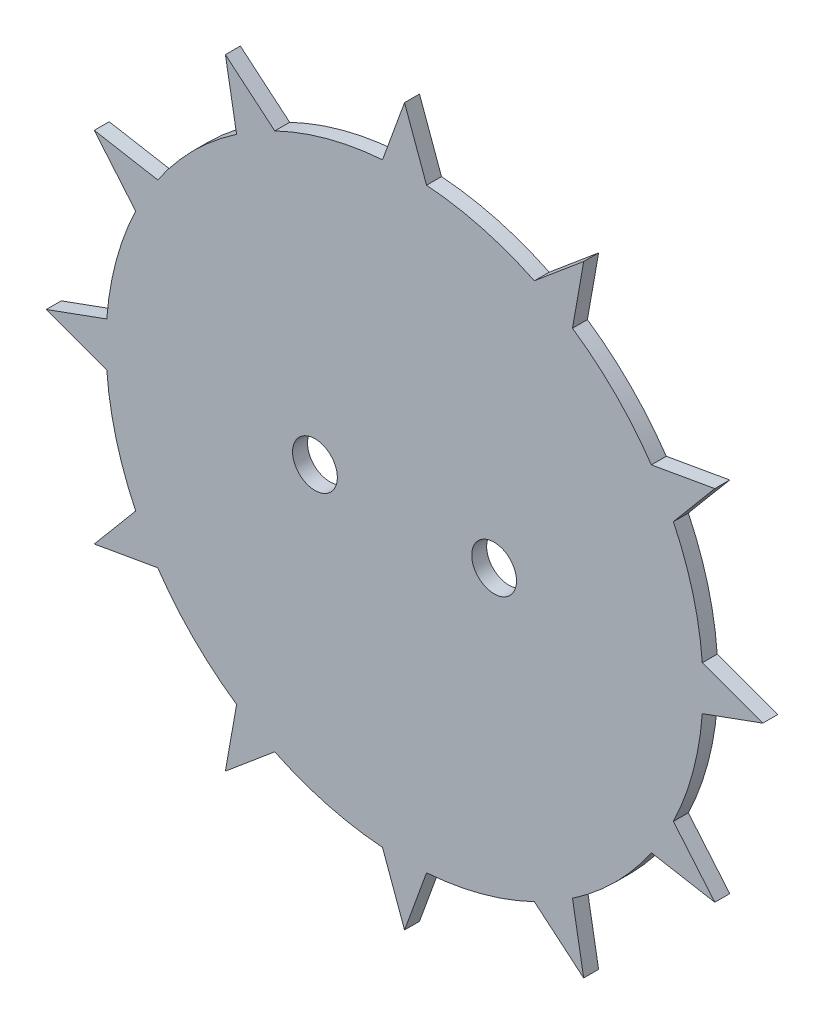
ISO-10303-21;
HEADER;
FILE_DESCRIPTION(('STEP AP214'),'2;1');
FILE_NAME('part.step','',(''),(''),'','','');
FILE_SCHEMA(('AUTOMOTIVE_DESIGN { 1 0 10303 214 1 1 1 1 }'));
ENDSEC;
DATA;
#1=APPLICATION_CONTEXT('core data for automotive mechanical design processes');
#2=APPLICATION_PROTOCOL_DEFINITION('international standard','automotive_design',2000,#1);
#3=PRODUCT_CONTEXT('',#1,'mechanical');
#4=PRODUCT('Part','Part','',(#3));
#5=PRODUCT_RELATED_PRODUCT_CATEGORY('part','',(#4));
#6=PRODUCT_DEFINITION_FORMATION('','',#4);
#7=PRODUCT_DEFINITION_CONTEXT('part definition',#1,'design');
#8=PRODUCT_DEFINITION('design','',#6,#7);
#9=PRODUCT_DEFINITION_SHAPE('','',#8);
#10=(LENGTH_UNIT() NAMED_UNIT(*) SI_UNIT(.MILLI.,.METRE.));
#11=(NAMED_UNIT(*) PLANE_ANGLE_UNIT() SI_UNIT($,.RADIAN.));
#12=(NAMED_UNIT(*) SI_UNIT($,.STERADIAN.) SOLID_ANGLE_UNIT());
#13=UNCERTAINTY_MEASURE_WITH_UNIT(LENGTH_MEASURE(1.E-05),#10,'distance_accuracy_value','');
#14=(GEOMETRIC_REPRESENTATION_CONTEXT(3) GLOBAL_UNCERTAINTY_ASSIGNED_CONTEXT((#13)) GLOBAL_UNIT_ASSIGNED_CONTEXT((#10,
#11,#12)) REPRESENTATION_CONTEXT('',''));
#15=CARTESIAN_POINT('',(0.,0.,0.));
#16=DIRECTION('',(0.,0.,1.));
#17=DIRECTION('',(1.,0.,0.));
#18=AXIS2_PLACEMENT_3D('',#15,#16,#17);
#19=CARTESIAN_POINT('',(0.,0.,1.));
#20=DIRECTION('',(0.,0.,-1.));
#21=DIRECTION('',(-1.,0.,0.));
#22=AXIS2_PLACEMENT_3D('',#19,#20,#21);
#23=CYLINDRICAL_SURFACE('',#22,20.);
#24=DIRECTION('',(0.,0.,-1.));
#25=VECTOR('',#24,1.);
#26=CARTESIAN_POINT('',(-8.6947263668177,18.0111558042832,1.));
#27=LINE('',#26,#25);
#28=CARTESIAN_POINT('',(-8.6947263668177,18.0111558042832,1.));
#29=VERTEX_POINT('',#28);
#30=CARTESIAN_POINT('',(-8.6947263668177,18.0111558042832,0.));
#31=VERTEX_POINT('',#30);
#32=EDGE_CURVE('E455',#29,#31,#27,.T.);
#33=ORIENTED_EDGE('',*,*,#32,.F.);
#34=CARTESIAN_POINT('',(0.,0.,1.));
#35=DIRECTION('',(0.,0.,1.));
#36=DIRECTION('',(1.,0.,0.));
#37=AXIS2_PLACEMENT_3D('',#34,#35,#36);
#38=CIRCLE('',#37,20.);
#39=CARTESIAN_POINT('',(-1.47572398952312,19.9454816614377,1.));
#40=VERTEX_POINT('',#39);
#41=EDGE_CURVE('E592',#40,#29,#38,.T.);
#42=ORIENTED_EDGE('',*,*,#41,.F.);
#43=DIRECTION('',(0.,0.,-1.));
#44=VECTOR('',#43,1.);
#45=CARTESIAN_POINT('',(-1.47572398952312,19.9454816614377,1.));
#46=LINE('',#45,#44);
#47=CARTESIAN_POINT('',(-1.47572398952312,19.9454816614377,0.));
#48=VERTEX_POINT('',#47);
#49=EDGE_CURVE('E288',#40,#48,#46,.T.);
#50=ORIENTED_EDGE('',*,*,#49,.T.);
#51=CARTESIAN_POINT('',(0.,0.,0.));
#52=DIRECTION('',(0.,0.,1.));
#53=DIRECTION('',(1.,0.,0.));
#54=AXIS2_PLACEMENT_3D('',#51,#52,#53);
#55=CIRCLE('',#54,20.);
#56=EDGE_CURVE('E302',#48,#31,#55,.T.);
#57=ORIENTED_EDGE('',*,*,#56,.T.);
#58=EDGE_LOOP('',(#33,#42,#50,#57));
#59=FACE_BOUND('',#58,.T.);
#60=ADVANCED_FACE('F36',(#59),#23,.T.);
#61=CARTESIAN_POINT('',(-11.25075529462,16.5354318147601,1.));
#62=VERTEX_POINT('',#61);
#63=CARTESIAN_POINT('',(-16.5354318147601,11.25075529462,1.));
#64=VERTEX_POINT('',#63);
#65=EDGE_CURVE('E596',#62,#64,#38,.T.);
#66=ORIENTED_EDGE('',*,*,#65,.F.);
#67=DIRECTION('',(0.,0.,-1.));
#68=VECTOR('',#67,1.);
#69=CARTESIAN_POINT('',(-11.25075529462,16.5354318147601,1.));
#70=LINE('',#69,#68);
#71=CARTESIAN_POINT('',(-11.25075529462,16.5354318147601,0.));
#72=VERTEX_POINT('',#71);
#73=EDGE_CURVE('E464',#62,#72,#70,.T.);
#74=ORIENTED_EDGE('',*,*,#73,.T.);
#75=CARTESIAN_POINT('',(-16.5354318147601,11.25075529462,0.));
#76=VERTEX_POINT('',#75);
#77=EDGE_CURVE('E308',#72,#76,#55,.T.);
#78=ORIENTED_EDGE('',*,*,#77,.T.);
#79=DIRECTION('',(0.,0.,-1.));
#80=VECTOR('',#79,1.);
#81=CARTESIAN_POINT('',(-16.5354318147601,11.25075529462,1.));
#82=LINE('',#81,#80);
#83=EDGE_CURVE('E473',#64,#76,#82,.T.);
#84=ORIENTED_EDGE('',*,*,#83,.F.);
#85=EDGE_LOOP('',(#66,#74,#78,#84));
#86=FACE_BOUND('',#85,.T.);
#87=ADVANCED_FACE('F644',(#86),#23,.T.);
#88=CARTESIAN_POINT('',(-18.0111558042832,8.69472636681768,1.));
#89=VERTEX_POINT('',#88);
#90=CARTESIAN_POINT('',(-19.9454816614377,1.47572398952311,1.));
#91=VERTEX_POINT('',#90);
#92=EDGE_CURVE('E597',#89,#91,#38,.T.);
#93=ORIENTED_EDGE('',*,*,#92,.F.);
#94=DIRECTION('',(0.,0.,-1.));
#95=VECTOR('',#94,1.);
#96=CARTESIAN_POINT('',(-18.0111558042832,8.69472636681768,1.));
#97=LINE('',#96,#95);
#98=CARTESIAN_POINT('',(-18.0111558042832,8.69472636681768,0.));
#99=VERTEX_POINT('',#98);
#100=EDGE_CURVE('E476',#89,#99,#97,.T.);
#101=ORIENTED_EDGE('',*,*,#100,.T.);
#102=CARTESIAN_POINT('',(-19.9454816614377,1.47572398952311,0.));
#103=VERTEX_POINT('',#102);
#104=EDGE_CURVE('E313',#99,#103,#55,.T.);
#105=ORIENTED_EDGE('',*,*,#104,.T.);
#106=DIRECTION('',(0.,0.,-1.));
#107=VECTOR('',#106,1.);
#108=CARTESIAN_POINT('',(-19.9454816614377,1.47572398952311,1.));
#109=LINE('',#108,#107);
#110=EDGE_CURVE('E488',#91,#103,#109,.T.);
#111=ORIENTED_EDGE('',*,*,#110,.F.);
#112=EDGE_LOOP('',(#93,#101,#105,#111));
#113=FACE_BOUND('',#112,.T.);
#114=ADVANCED_FACE('F648',(#113),#23,.T.);
#115=CARTESIAN_POINT('',(-19.9454816614377,-1.47572398952312,1.));
#116=VERTEX_POINT('',#115);
#117=CARTESIAN_POINT('',(-18.0111558042832,-8.69472636681769,1.));
#118=VERTEX_POINT('',#117);
#119=EDGE_CURVE('E605',#116,#118,#38,.T.);
#120=ORIENTED_EDGE('',*,*,#119,.F.);
#121=DIRECTION('',(0.,0.,-1.));
#122=VECTOR('',#121,1.);
#123=CARTESIAN_POINT('',(-19.9454816614377,-1.47572398952312,1.));
#124=LINE('',#123,#122);
#125=CARTESIAN_POINT('',(-19.9454816614377,-1.47572398952312,0.));
#126=VERTEX_POINT('',#125);
#127=EDGE_CURVE('E494',#116,#126,#124,.T.);
#128=ORIENTED_EDGE('',*,*,#127,.T.);
#129=CARTESIAN_POINT('',(-18.0111558042832,-8.69472636681769,0.));
#130=VERTEX_POINT('',#129);
#131=EDGE_CURVE('E320',#126,#130,#55,.T.);
#132=ORIENTED_EDGE('',*,*,#131,.T.);
#133=DIRECTION('',(0.,0.,-1.));
#134=VECTOR('',#133,1.);
#135=CARTESIAN_POINT('',(-18.0111558042832,-8.69472636681769,1.));
#136=LINE('',#135,#134);
#137=EDGE_CURVE('E502',#118,#130,#136,.T.);
#138=ORIENTED_EDGE('',*,*,#137,.F.);
#139=EDGE_LOOP('',(#120,#128,#132,#138));
#140=FACE_BOUND('',#139,.T.);
#141=ADVANCED_FACE('F748',(#140),#23,.T.);
#142=CARTESIAN_POINT('',(-16.5354318147601,-11.25075529462,1.));
#143=VERTEX_POINT('',#142);
#144=CARTESIAN_POINT('',(-11.25075529462,-16.5354318147601,1.));
#145=VERTEX_POINT('',#144);
#146=EDGE_CURVE('E604',#143,#145,#38,.T.);
#147=ORIENTED_EDGE('',*,*,#146,.F.);
#148=DIRECTION('',(0.,0.,-1.));
#149=VECTOR('',#148,1.);
#150=CARTESIAN_POINT('',(-16.5354318147601,-11.25075529462,1.));
#151=LINE('',#150,#149);
#152=CARTESIAN_POINT('',(-16.5354318147601,-11.25075529462,0.));
#153=VERTEX_POINT('',#152);
#154=EDGE_CURVE('E506',#143,#153,#151,.T.);
#155=ORIENTED_EDGE('',*,*,#154,.T.);
#156=CARTESIAN_POINT('',(-11.25075529462,-16.5354318147601,0.));
#157=VERTEX_POINT('',#156);
#158=EDGE_CURVE('E323',#153,#157,#55,.T.);
#159=ORIENTED_EDGE('',*,*,#158,.T.);
#160=DIRECTION('',(0.,0.,-1.));
#161=VECTOR('',#160,1.);
#162=CARTESIAN_POINT('',(-11.25075529462,-16.5354318147601,1.));
#163=LINE('',#162,#161);
#164=EDGE_CURVE('E388',#145,#157,#163,.T.);
#165=ORIENTED_EDGE('',*,*,#164,.F.);
#166=EDGE_LOOP('',(#147,#155,#159,#165));
#167=FACE_BOUND('',#166,.T.);
#168=ADVANCED_FACE('F743',(#167),#23,.T.);
#169=CARTESIAN_POINT('',(-8.69472636681769,-18.0111558042832,1.));
#170=VERTEX_POINT('',#169);
#171=CARTESIAN_POINT('',(-1.47572398952312,-19.9454816614377,1.));
#172=VERTEX_POINT('',#171);
#173=EDGE_CURVE('E609',#170,#172,#38,.T.);
#174=ORIENTED_EDGE('',*,*,#173,.F.);
#175=DIRECTION('',(0.,0.,-1.));
#176=VECTOR('',#175,1.);
#177=CARTESIAN_POINT('',(-8.69472636681769,-18.0111558042832,1.));
#178=LINE('',#177,#176);
#179=CARTESIAN_POINT('',(-8.69472636681768,-18.0111558042832,0.));
#180=VERTEX_POINT('',#179);
#181=EDGE_CURVE('E399',#170,#180,#178,.T.);
#182=ORIENTED_EDGE('',*,*,#181,.T.);
#183=CARTESIAN_POINT('',(-1.47572398952312,-19.9454816614377,0.));
#184=VERTEX_POINT('',#183);
#185=EDGE_CURVE('E328',#180,#184,#55,.T.);
#186=ORIENTED_EDGE('',*,*,#185,.T.);
#187=DIRECTION('',(0.,0.,-1.));
#188=VECTOR('',#187,1.);
#189=CARTESIAN_POINT('',(-1.47572398952312,-19.9454816614377,1.));
#190=LINE('',#189,#188);
#191=EDGE_CURVE('E408',#172,#184,#190,.T.);
#192=ORIENTED_EDGE('',*,*,#191,.F.);
#193=EDGE_LOOP('',(#174,#182,#186,#192));
#194=FACE_BOUND('',#193,.T.);
#195=ADVANCED_FACE('F736',(#194),#23,.T.);
#196=CARTESIAN_POINT('',(1.47572398952312,-19.9454816614377,1.));
#197=VERTEX_POINT('',#196);
#198=CARTESIAN_POINT('',(8.69472636681769,-18.0111558042832,1.));
#199=VERTEX_POINT('',#198);
#200=EDGE_CURVE('E369',#197,#199,#38,.T.);
#201=ORIENTED_EDGE('',*,*,#200,.F.);
#202=DIRECTION('',(0.,0.,-1.));
#203=VECTOR('',#202,1.);
#204=CARTESIAN_POINT('',(1.47572398952312,-19.9454816614377,1.));
#205=LINE('',#204,#203);
#206=CARTESIAN_POINT('',(1.47572398952312,-19.9454816614377,0.));
#207=VERTEX_POINT('',#206);
#208=EDGE_CURVE('E418',#197,#207,#205,.T.);
#209=ORIENTED_EDGE('',*,*,#208,.T.);
#210=CARTESIAN_POINT('',(8.69472636681769,-18.0111558042832,0.));
#211=VERTEX_POINT('',#210);
#212=EDGE_CURVE('E333',#207,#211,#55,.T.);
#213=ORIENTED_EDGE('',*,*,#212,.T.);
#214=DIRECTION('',(0.,0.,-1.));
#215=VECTOR('',#214,1.);
#216=CARTESIAN_POINT('',(8.69472636681769,-18.0111558042832,1.));
#217=LINE('',#216,#215);
#218=EDGE_CURVE('E422',#199,#211,#217,.T.);
#219=ORIENTED_EDGE('',*,*,#218,.F.);
#220=EDGE_LOOP('',(#201,#209,#213,#219));
#221=FACE_BOUND('',#220,.T.);
#222=ADVANCED_FACE('F618',(#221),#23,.T.);
#223=CARTESIAN_POINT('',(11.25075529462,-16.5354318147601,1.));
#224=VERTEX_POINT('',#223);
#225=CARTESIAN_POINT('',(16.5354318147601,-11.25075529462,1.));
#226=VERTEX_POINT('',#225);
#227=EDGE_CURVE('E365',#224,#226,#38,.T.);
#228=ORIENTED_EDGE('',*,*,#227,.F.);
#229=DIRECTION('',(0.,0.,-1.));
#230=VECTOR('',#229,1.);
#231=CARTESIAN_POINT('',(11.25075529462,-16.5354318147601,1.));
#232=LINE('',#231,#230);
#233=CARTESIAN_POINT('',(11.25075529462,-16.5354318147601,0.));
#234=VERTEX_POINT('',#233);
#235=EDGE_CURVE('E435',#224,#234,#232,.T.);
#236=ORIENTED_EDGE('',*,*,#235,.T.);
#237=CARTESIAN_POINT('',(16.5354318147601,-11.25075529462,0.));
#238=VERTEX_POINT('',#237);
#239=EDGE_CURVE('E343',#234,#238,#55,.T.);
#240=ORIENTED_EDGE('',*,*,#239,.T.);
#241=DIRECTION('',(0.,0.,-1.));
#242=VECTOR('',#241,1.);
#243=CARTESIAN_POINT('',(16.5354318147601,-11.25075529462,1.));
#244=LINE('',#243,#242);
#245=EDGE_CURVE('E439',#226,#238,#244,.T.);
#246=ORIENTED_EDGE('',*,*,#245,.F.);
#247=EDGE_LOOP('',(#228,#236,#240,#246));
#248=FACE_BOUND('',#247,.T.);
#249=ADVANCED_FACE('F624',(#248),#23,.T.);
#250=DIRECTION('',(0.,0.,-1.));
#251=VECTOR('',#250,1.);
#252=CARTESIAN_POINT('',(1.47572398952311,19.9454816614377,1.));
#253=LINE('',#252,#251);
#254=CARTESIAN_POINT('',(1.47572398952311,19.9454816614377,1.));
#255=VERTEX_POINT('',#254);
#256=CARTESIAN_POINT('',(1.47572398952311,19.9454816614377,0.));
#257=VERTEX_POINT('',#256);
#258=EDGE_CURVE('E273',#255,#257,#253,.T.);
#259=ORIENTED_EDGE('',*,*,#258,.F.);
#260=CARTESIAN_POINT('',(8.69472636681767,18.0111558042832,1.));
#261=VERTEX_POINT('',#260);
#262=EDGE_CURVE('E593',#261,#255,#38,.T.);
#263=ORIENTED_EDGE('',*,*,#262,.F.);
#264=DIRECTION('',(0.,0.,-1.));
#265=VECTOR('',#264,1.);
#266=CARTESIAN_POINT('',(8.69472636681767,18.0111558042832,1.));
#267=LINE('',#266,#265);
#268=CARTESIAN_POINT('',(8.69472636681767,18.0111558042832,0.));
#269=VERTEX_POINT('',#268);
#270=EDGE_CURVE('E303',#261,#269,#267,.T.);
#271=ORIENTED_EDGE('',*,*,#270,.T.);
#272=EDGE_CURVE('E295',#269,#257,#55,.T.);
#273=ORIENTED_EDGE('',*,*,#272,.T.);
#274=EDGE_LOOP('',(#259,#263,#271,#273));
#275=FACE_BOUND('',#274,.T.);
#276=ADVANCED_FACE('F298',(#275),#23,.T.);
#277=DIRECTION('',(0.,0.,-1.));
#278=VECTOR('',#277,1.);
#279=CARTESIAN_POINT('',(11.25075529462,16.5354318147601,1.));
#280=LINE('',#279,#278);
#281=CARTESIAN_POINT('',(11.25075529462,16.5354318147601,1.));
#282=VERTEX_POINT('',#281);
#283=CARTESIAN_POINT('',(11.25075529462,16.5354318147601,0.));
#284=VERTEX_POINT('',#283);
#285=EDGE_CURVE('E539',#282,#284,#280,.T.);
#286=ORIENTED_EDGE('',*,*,#285,.F.);
#287=CARTESIAN_POINT('',(16.5354318147601,11.25075529462,1.));
#288=VERTEX_POINT('',#287);
#289=EDGE_CURVE('E46',#288,#282,#38,.T.);
#290=ORIENTED_EDGE('',*,*,#289,.F.);
#291=DIRECTION('',(0.,0.,-1.));
#292=VECTOR('',#291,1.);
#293=CARTESIAN_POINT('',(16.5354318147601,11.25075529462,1.));
#294=LINE('',#293,#292);
#295=CARTESIAN_POINT('',(16.5354318147601,11.25075529462,0.));
#296=VERTEX_POINT('',#295);
#297=EDGE_CURVE('E527',#288,#296,#294,.T.);
#298=ORIENTED_EDGE('',*,*,#297,.T.);
#299=EDGE_CURVE('E304',#296,#284,#55,.T.);
#300=ORIENTED_EDGE('',*,*,#299,.T.);
#301=EDGE_LOOP('',(#286,#290,#298,#300));
#302=FACE_BOUND('',#301,.T.);
#303=ADVANCED_FACE('F653',(#302),#23,.T.);
#304=DIRECTION('',(0.,0.,-1.));
#305=VECTOR('',#304,1.);
#306=CARTESIAN_POINT('',(18.0111558042832,8.6947263668177,1.));
#307=LINE('',#306,#305);
#308=CARTESIAN_POINT('',(18.0111558042832,8.6947263668177,1.));
#309=VERTEX_POINT('',#308);
#310=CARTESIAN_POINT('',(18.0111558042832,8.6947263668177,0.));
#311=VERTEX_POINT('',#310);
#312=EDGE_CURVE('E517',#309,#311,#307,.T.);
#313=ORIENTED_EDGE('',*,*,#312,.F.);
#314=CARTESIAN_POINT('',(19.9454816614377,1.47572398952312,1.));
#315=VERTEX_POINT('',#314);
#316=EDGE_CURVE('E11',#315,#309,#38,.T.);
#317=ORIENTED_EDGE('',*,*,#316,.F.);
#318=DIRECTION('',(0.,0.,-1.));
#319=VECTOR('',#318,1.);
#320=CARTESIAN_POINT('',(19.9454816614377,1.47572398952312,1.));
#321=LINE('',#320,#319);
#322=CARTESIAN_POINT('',(19.9454816614377,1.47572398952312,0.));
#323=VERTEX_POINT('',#322);
#324=EDGE_CURVE('E359',#315,#323,#321,.T.);
#325=ORIENTED_EDGE('',*,*,#324,.T.);
#326=EDGE_CURVE('E41',#323,#311,#55,.T.);
#327=ORIENTED_EDGE('',*,*,#326,.T.);
#328=EDGE_LOOP('',(#313,#317,#325,#327));
#329=FACE_BOUND('',#328,.T.);
#330=ADVANCED_FACE('F580',(#329),#23,.T.);
#331=CARTESIAN_POINT('',(18.0111558042832,-8.69472636681769,1.));
#332=VERTEX_POINT('',#331);
#333=CARTESIAN_POINT('',(19.9454816614377,-1.47572398952312,1.));
#334=VERTEX_POINT('',#333);
#335=EDGE_CURVE('E50',#332,#334,#38,.T.);
#336=ORIENTED_EDGE('',*,*,#335,.F.);
#337=DIRECTION('',(0.,0.,-1.));
#338=VECTOR('',#337,1.);
#339=CARTESIAN_POINT('',(18.0111558042832,-8.69472636681769,1.));
#340=LINE('',#339,#338);
#341=CARTESIAN_POINT('',(18.0111558042832,-8.69472636681768,0.));
#342=VERTEX_POINT('',#341);
#343=EDGE_CURVE('E443',#332,#342,#340,.T.);
#344=ORIENTED_EDGE('',*,*,#343,.T.);
#345=CARTESIAN_POINT('',(19.9454816614377,-1.47572398952312,0.));
#346=VERTEX_POINT('',#345);
#347=EDGE_CURVE('E350',#342,#346,#55,.T.);
#348=ORIENTED_EDGE('',*,*,#347,.T.);
#349=DIRECTION('',(0.,0.,-1.));
#350=VECTOR('',#349,1.);
#351=CARTESIAN_POINT('',(19.9454816614377,-1.47572398952312,1.));
#352=LINE('',#351,#350);
#353=EDGE_CURVE('E375',#334,#346,#352,.T.);
#354=ORIENTED_EDGE('',*,*,#353,.F.);
#355=EDGE_LOOP('',(#336,#344,#348,#354));
#356=FACE_BOUND('',#355,.T.);
#357=ADVANCED_FACE('F575',(#356),#23,.T.);
#358=CARTESIAN_POINT('',(0.,0.,1.));
#359=DIRECTION('',(0.,0.,1.));
#360=DIRECTION('',(1.,0.,0.));
#361=AXIS2_PLACEMENT_3D('',#358,#359,#360);
#362=PLANE('',#361);
#363=CARTESIAN_POINT('',(6.,0.,1.));
#364=DIRECTION('',(0.,0.,1.));
#365=DIRECTION('',(1.,0.,0.));
#366=AXIS2_PLACEMENT_3D('',#363,#364,#365);
#367=CIRCLE('',#366,1.5);
#368=CARTESIAN_POINT('',(7.5,0.,1.));
#369=VERTEX_POINT('',#368);
#370=EDGE_CURVE('E560',#369,#369,#367,.T.);
#371=ORIENTED_EDGE('',*,*,#370,.F.);
#372=EDGE_LOOP('',(#371));
#373=FACE_BOUND('',#372,.T.);
#374=CARTESIAN_POINT('',(-6.,0.,1.));
#375=DIRECTION('',(0.,0.,1.));
#376=DIRECTION('',(-1.,0.,0.));
#377=AXIS2_PLACEMENT_3D('',#374,#375,#376);
#378=CIRCLE('',#377,1.5);
#379=CARTESIAN_POINT('',(-7.5,0.,1.));
#380=VERTEX_POINT('',#379);
#381=EDGE_CURVE('E553',#380,#380,#378,.T.);
#382=ORIENTED_EDGE('',*,*,#381,.F.);
#383=EDGE_LOOP('',(#382));
#384=FACE_BOUND('',#383,.T.);
#385=ORIENTED_EDGE('',*,*,#316,.T.);
#386=DIRECTION('',(0.642787609686545,0.766044443118974,0.));
#387=VECTOR('',#386,1.);
#388=CARTESIAN_POINT('',(20.7846096908265,12.,1.));
#389=LINE('',#388,#387);
#390=CARTESIAN_POINT('',(20.7846096908265,12.,1.));
#391=VERTEX_POINT('',#390);
#392=EDGE_CURVE('E514',#309,#391,#389,.T.);
#393=ORIENTED_EDGE('',*,*,#392,.T.);
#394=DIRECTION('',(-0.984807753012207,-0.173648177666937,0.));
#395=VECTOR('',#394,1.);
#396=CARTESIAN_POINT('',(20.7846096908265,12.,1.));
#397=LINE('',#396,#395);
#398=EDGE_CURVE('E520',#391,#288,#397,.T.);
#399=ORIENTED_EDGE('',*,*,#398,.T.);
#400=ORIENTED_EDGE('',*,*,#289,.T.);
#401=DIRECTION('',(0.173648177666937,0.984807753012207,0.));
#402=VECTOR('',#401,1.);
#403=CARTESIAN_POINT('',(12.,20.7846096908265,1.));
#404=LINE('',#403,#402);
#405=CARTESIAN_POINT('',(12.,20.7846096908265,1.));
#406=VERTEX_POINT('',#405);
#407=EDGE_CURVE('E534',#282,#406,#404,.T.);
#408=ORIENTED_EDGE('',*,*,#407,.T.);
#409=DIRECTION('',(-0.766044443118973,-0.642787609686545,0.));
#410=VECTOR('',#409,1.);
#411=CARTESIAN_POINT('',(12.,20.7846096908265,1.));
#412=LINE('',#411,#410);
#413=EDGE_CURVE('E538',#406,#261,#412,.T.);
#414=ORIENTED_EDGE('',*,*,#413,.T.);
#415=ORIENTED_EDGE('',*,*,#262,.T.);
#416=DIRECTION('',(-0.342020143325662,0.939692620785911,0.));
#417=VECTOR('',#416,1.);
#418=CARTESIAN_POINT('',(0.,24.,1.));
#419=LINE('',#418,#417);
#420=CARTESIAN_POINT('',(0.,24.,1.));
#421=VERTEX_POINT('',#420);
#422=EDGE_CURVE('E278',#255,#421,#419,.T.);
#423=ORIENTED_EDGE('',*,*,#422,.T.);
#424=DIRECTION('',(-0.342020143325662,-0.939692620785911,0.));
#425=VECTOR('',#424,1.);
#426=CARTESIAN_POINT('',(0.,24.,1.));
#427=LINE('',#426,#425);
#428=EDGE_CURVE('E282',#421,#40,#427,.T.);
#429=ORIENTED_EDGE('',*,*,#428,.T.);
#430=ORIENTED_EDGE('',*,*,#41,.T.);
#431=DIRECTION('',(-0.766044443118974,0.642787609686545,0.));
#432=VECTOR('',#431,1.);
#433=CARTESIAN_POINT('',(-12.,20.7846096908265,1.));
#434=LINE('',#433,#432);
#435=CARTESIAN_POINT('',(-12.,20.7846096908265,1.));
#436=VERTEX_POINT('',#435);
#437=EDGE_CURVE('E450',#29,#436,#434,.T.);
#438=ORIENTED_EDGE('',*,*,#437,.T.);
#439=DIRECTION('',(0.173648177666937,-0.984807753012207,0.));
#440=VECTOR('',#439,1.);
#441=CARTESIAN_POINT('',(-12.,20.7846096908265,1.));
#442=LINE('',#441,#440);
#443=EDGE_CURVE('E454',#436,#62,#442,.T.);
#444=ORIENTED_EDGE('',*,*,#443,.T.);
#445=ORIENTED_EDGE('',*,*,#65,.T.);
#446=DIRECTION('',(-0.984807753012207,0.173648177666937,0.));
#447=VECTOR('',#446,1.);
#448=CARTESIAN_POINT('',(-20.7846096908265,12.,1.));
#449=LINE('',#448,#447);
#450=CARTESIAN_POINT('',(-20.7846096908265,12.,1.));
#451=VERTEX_POINT('',#450);
#452=EDGE_CURVE('E462',#64,#451,#449,.T.);
#453=ORIENTED_EDGE('',*,*,#452,.T.);
#454=DIRECTION('',(0.642787609686545,-0.766044443118973,0.));
#455=VECTOR('',#454,1.);
#456=CARTESIAN_POINT('',(-20.7846096908265,12.,1.));
#457=LINE('',#456,#455);
#458=EDGE_CURVE('E470',#451,#89,#457,.T.);
#459=ORIENTED_EDGE('',*,*,#458,.T.);
#460=ORIENTED_EDGE('',*,*,#92,.T.);
#461=DIRECTION('',(-0.939692620785911,-0.342020143325662,0.));
#462=VECTOR('',#461,1.);
#463=CARTESIAN_POINT('',(-24.,0.,1.));
#464=LINE('',#463,#462);
#465=CARTESIAN_POINT('',(-24.,0.,1.));
#466=VERTEX_POINT('',#465);
#467=EDGE_CURVE('E485',#91,#466,#464,.T.);
#468=ORIENTED_EDGE('',*,*,#467,.T.);
#469=DIRECTION('',(0.939692620785911,-0.342020143325662,0.));
#470=VECTOR('',#469,1.);
#471=CARTESIAN_POINT('',(-24.,0.,1.));
#472=LINE('',#471,#470);
#473=EDGE_CURVE('E486',#466,#116,#472,.T.);
#474=ORIENTED_EDGE('',*,*,#473,.T.);
#475=ORIENTED_EDGE('',*,*,#119,.T.);
#476=DIRECTION('',(-0.642787609686545,-0.766044443118974,0.));
#477=VECTOR('',#476,1.);
#478=CARTESIAN_POINT('',(-20.7846096908265,-12.,1.));
#479=LINE('',#478,#477);
#480=CARTESIAN_POINT('',(-20.7846096908265,-12.,1.));
#481=VERTEX_POINT('',#480);
#482=EDGE_CURVE('E496',#118,#481,#479,.T.);
#483=ORIENTED_EDGE('',*,*,#482,.T.);
#484=DIRECTION('',(0.984807753012207,0.173648177666937,0.));
#485=VECTOR('',#484,1.);
#486=CARTESIAN_POINT('',(-20.7846096908265,-12.,1.));
#487=LINE('',#486,#485);
#488=EDGE_CURVE('E505',#481,#143,#487,.T.);
#489=ORIENTED_EDGE('',*,*,#488,.T.);
#490=ORIENTED_EDGE('',*,*,#146,.T.);
#491=DIRECTION('',(-0.173648177666938,-0.984807753012207,0.));
#492=VECTOR('',#491,1.);
#493=CARTESIAN_POINT('',(-12.,-20.7846096908265,1.));
#494=LINE('',#493,#492);
#495=CARTESIAN_POINT('',(-12.,-20.7846096908265,1.));
#496=VERTEX_POINT('',#495);
#497=EDGE_CURVE('E383',#145,#496,#494,.T.);
#498=ORIENTED_EDGE('',*,*,#497,.T.);
#499=DIRECTION('',(0.766044443118973,0.642787609686545,0.));
#500=VECTOR('',#499,1.);
#501=CARTESIAN_POINT('',(-12.,-20.7846096908265,1.));
#502=LINE('',#501,#500);
#503=EDGE_CURVE('E389',#496,#170,#502,.T.);
#504=ORIENTED_EDGE('',*,*,#503,.T.);
#505=ORIENTED_EDGE('',*,*,#173,.T.);
#506=DIRECTION('',(0.342020143325662,-0.939692620785911,0.));
#507=VECTOR('',#506,1.);
#508=CARTESIAN_POINT('',(0.,-24.,1.));
#509=LINE('',#508,#507);
#510=CARTESIAN_POINT('',(0.,-24.,1.));
#511=VERTEX_POINT('',#510);
#512=EDGE_CURVE('E401',#172,#511,#509,.T.);
#513=ORIENTED_EDGE('',*,*,#512,.T.);
#514=DIRECTION('',(0.342020143325662,0.939692620785911,0.));
#515=VECTOR('',#514,1.);
#516=CARTESIAN_POINT('',(0.,-24.,1.));
#517=LINE('',#516,#515);
#518=EDGE_CURVE('E406',#511,#197,#517,.T.);
#519=ORIENTED_EDGE('',*,*,#518,.T.);
#520=ORIENTED_EDGE('',*,*,#200,.T.);
#521=DIRECTION('',(0.766044443118974,-0.642787609686545,0.));
#522=VECTOR('',#521,1.);
#523=CARTESIAN_POINT('',(12.,-20.7846096908265,1.));
#524=LINE('',#523,#522);
#525=CARTESIAN_POINT('',(12.,-20.7846096908265,1.));
#526=VERTEX_POINT('',#525);
#527=EDGE_CURVE('E419',#199,#526,#524,.T.);
#528=ORIENTED_EDGE('',*,*,#527,.T.);
#529=DIRECTION('',(-0.173648177666937,0.984807753012207,0.));
#530=VECTOR('',#529,1.);
#531=CARTESIAN_POINT('',(12.,-20.7846096908265,1.));
#532=LINE('',#531,#530);
#533=EDGE_CURVE('E421',#526,#224,#532,.T.);
#534=ORIENTED_EDGE('',*,*,#533,.T.);
#535=ORIENTED_EDGE('',*,*,#227,.T.);
#536=DIRECTION('',(0.984807753012207,-0.173648177666938,0.));
#537=VECTOR('',#536,1.);
#538=CARTESIAN_POINT('',(20.7846096908265,-12.,1.));
#539=LINE('',#538,#537);
#540=CARTESIAN_POINT('',(20.7846096908265,-12.,1.));
#541=VERTEX_POINT('',#540);
#542=EDGE_CURVE('E434',#226,#541,#539,.T.);
#543=ORIENTED_EDGE('',*,*,#542,.T.);
#544=DIRECTION('',(-0.642787609686545,0.766044443118974,0.));
#545=VECTOR('',#544,1.);
#546=CARTESIAN_POINT('',(20.7846096908265,-12.,1.));
#547=LINE('',#546,#545);
#548=EDGE_CURVE('E437',#541,#332,#547,.T.);
#549=ORIENTED_EDGE('',*,*,#548,.T.);
#550=ORIENTED_EDGE('',*,*,#335,.T.);
#551=DIRECTION('',(0.939692620785911,0.342020143325662,0.));
#552=VECTOR('',#551,1.);
#553=CARTESIAN_POINT('',(24.,0.,1.));
#554=LINE('',#553,#552);
#555=CARTESIAN_POINT('',(24.,0.,1.));
#556=VERTEX_POINT('',#555);
#557=EDGE_CURVE('E380',#334,#556,#554,.T.);
#558=ORIENTED_EDGE('',*,*,#557,.T.);
#559=DIRECTION('',(-0.939692620785911,0.342020143325663,0.));
#560=VECTOR('',#559,1.);
#561=CARTESIAN_POINT('',(24.,0.,1.));
#562=LINE('',#561,#560);
#563=EDGE_CURVE('E372',#556,#315,#562,.T.);
#564=ORIENTED_EDGE('',*,*,#563,.T.);
#565=EDGE_LOOP('',(#385,#393,#399,#400,#408,#414,#415,#423,#429,#430,#438,#444,#445,#453,#459,
#460,#468,#474,#475,#483,#489,#490,#498,#504,#505,#513,#519,#520,#528,#534,#535,#543,#549,#550,
#558,#564));
#566=FACE_BOUND('',#565,.T.);
#567=ADVANCED_FACE('F568',(#373,#384,#566),#362,.T.);
#568=CARTESIAN_POINT('',(0.,0.,0.));
#569=DIRECTION('',(0.,0.,1.));
#570=DIRECTION('',(1.,0.,0.));
#571=AXIS2_PLACEMENT_3D('',#568,#569,#570);
#572=PLANE('',#571);
#573=CARTESIAN_POINT('',(6.,0.,0.));
#574=DIRECTION('',(0.,0.,1.));
#575=DIRECTION('',(1.,0.,0.));
#576=AXIS2_PLACEMENT_3D('',#573,#574,#575);
#577=CIRCLE('',#576,1.5);
#578=CARTESIAN_POINT('',(7.5,0.,0.));
#579=VERTEX_POINT('',#578);
#580=EDGE_CURVE('E531',#579,#579,#577,.F.);
#581=ORIENTED_EDGE('',*,*,#580,.F.);
#582=EDGE_LOOP('',(#581));
#583=FACE_BOUND('',#582,.T.);
#584=CARTESIAN_POINT('',(-6.,0.,0.));
#585=DIRECTION('',(0.,0.,1.));
#586=DIRECTION('',(1.,0.,0.));
#587=AXIS2_PLACEMENT_3D('',#584,#585,#586);
#588=CIRCLE('',#587,1.5);
#589=CARTESIAN_POINT('',(-4.5,0.,0.));
#590=VERTEX_POINT('',#589);
#591=EDGE_CURVE('E558',#590,#590,#588,.F.);
#592=ORIENTED_EDGE('',*,*,#591,.F.);
#593=EDGE_LOOP('',(#592));
#594=FACE_BOUND('',#593,.T.);
#595=ORIENTED_EDGE('',*,*,#326,.F.);
#596=DIRECTION('',(-0.939692620785911,0.342020143325663,0.));
#597=VECTOR('',#596,1.);
#598=CARTESIAN_POINT('',(24.,0.,0.));
#599=LINE('',#598,#597);
#600=CARTESIAN_POINT('',(24.,0.,0.));
#601=VERTEX_POINT('',#600);
#602=EDGE_CURVE('E374',#601,#323,#599,.T.);
#603=ORIENTED_EDGE('',*,*,#602,.F.);
#604=DIRECTION('',(0.939692620785911,0.342020143325662,0.));
#605=VECTOR('',#604,1.);
#606=CARTESIAN_POINT('',(24.,0.,0.));
#607=LINE('',#606,#605);
#608=EDGE_CURVE('E378',#346,#601,#607,.T.);
#609=ORIENTED_EDGE('',*,*,#608,.F.);
#610=ORIENTED_EDGE('',*,*,#347,.F.);
#611=DIRECTION('',(-0.642787609686545,0.766044443118974,0.));
#612=VECTOR('',#611,1.);
#613=CARTESIAN_POINT('',(20.7846096908265,-12.,0.));
#614=LINE('',#613,#612);
#615=CARTESIAN_POINT('',(20.7846096908265,-12.,0.));
#616=VERTEX_POINT('',#615);
#617=EDGE_CURVE('E53',#616,#342,#614,.T.);
#618=ORIENTED_EDGE('',*,*,#617,.F.);
#619=DIRECTION('',(0.984807753012207,-0.173648177666938,0.));
#620=VECTOR('',#619,1.);
#621=CARTESIAN_POINT('',(20.7846096908265,-12.,0.));
#622=LINE('',#621,#620);
#623=EDGE_CURVE('E381',#238,#616,#622,.T.);
#624=ORIENTED_EDGE('',*,*,#623,.F.);
#625=ORIENTED_EDGE('',*,*,#239,.F.);
#626=DIRECTION('',(-0.173648177666937,0.984807753012207,0.));
#627=VECTOR('',#626,1.);
#628=CARTESIAN_POINT('',(12.,-20.7846096908265,0.));
#629=LINE('',#628,#627);
#630=CARTESIAN_POINT('',(12.,-20.7846096908265,0.));
#631=VERTEX_POINT('',#630);
#632=EDGE_CURVE('E61',#631,#234,#629,.T.);
#633=ORIENTED_EDGE('',*,*,#632,.F.);
#634=DIRECTION('',(0.766044443118974,-0.642787609686545,0.));
#635=VECTOR('',#634,1.);
#636=CARTESIAN_POINT('',(12.,-20.7846096908265,0.));
#637=LINE('',#636,#635);
#638=EDGE_CURVE('E426',#211,#631,#637,.T.);
#639=ORIENTED_EDGE('',*,*,#638,.F.);
#640=ORIENTED_EDGE('',*,*,#212,.F.);
#641=DIRECTION('',(0.342020143325662,0.939692620785911,0.));
#642=VECTOR('',#641,1.);
#643=CARTESIAN_POINT('',(0.,-24.,0.));
#644=LINE('',#643,#642);
#645=CARTESIAN_POINT('',(0.,-24.,0.));
#646=VERTEX_POINT('',#645);
#647=EDGE_CURVE('E409',#646,#207,#644,.T.);
#648=ORIENTED_EDGE('',*,*,#647,.F.);
#649=DIRECTION('',(0.342020143325662,-0.939692620785911,0.));
#650=VECTOR('',#649,1.);
#651=CARTESIAN_POINT('',(0.,-24.,0.));
#652=LINE('',#651,#650);
#653=EDGE_CURVE('E407',#184,#646,#652,.T.);
#654=ORIENTED_EDGE('',*,*,#653,.F.);
#655=ORIENTED_EDGE('',*,*,#185,.F.);
#656=DIRECTION('',(0.766044443118973,0.642787609686545,0.));
#657=VECTOR('',#656,1.);
#658=CARTESIAN_POINT('',(-12.,-20.7846096908265,0.));
#659=LINE('',#658,#657);
#660=CARTESIAN_POINT('',(-12.,-20.7846096908265,0.));
#661=VERTEX_POINT('',#660);
#662=EDGE_CURVE('E390',#661,#180,#659,.T.);
#663=ORIENTED_EDGE('',*,*,#662,.F.);
#664=DIRECTION('',(-0.173648177666938,-0.984807753012207,0.));
#665=VECTOR('',#664,1.);
#666=CARTESIAN_POINT('',(-12.,-20.7846096908265,0.));
#667=LINE('',#666,#665);
#668=EDGE_CURVE('E394',#157,#661,#667,.T.);
#669=ORIENTED_EDGE('',*,*,#668,.F.);
#670=ORIENTED_EDGE('',*,*,#158,.F.);
#671=DIRECTION('',(0.984807753012207,0.173648177666937,0.));
#672=VECTOR('',#671,1.);
#673=CARTESIAN_POINT('',(-20.7846096908265,-12.,0.));
#674=LINE('',#673,#672);
#675=CARTESIAN_POINT('',(-20.7846096908265,-12.,0.));
#676=VERTEX_POINT('',#675);
#677=EDGE_CURVE('E501',#676,#153,#674,.T.);
#678=ORIENTED_EDGE('',*,*,#677,.F.);
#679=DIRECTION('',(-0.642787609686545,-0.766044443118974,0.));
#680=VECTOR('',#679,1.);
#681=CARTESIAN_POINT('',(-20.7846096908265,-12.,0.));
#682=LINE('',#681,#680);
#683=EDGE_CURVE('E405',#130,#676,#682,.T.);
#684=ORIENTED_EDGE('',*,*,#683,.F.);
#685=ORIENTED_EDGE('',*,*,#131,.F.);
#686=DIRECTION('',(0.939692620785911,-0.342020143325662,0.));
#687=VECTOR('',#686,1.);
#688=CARTESIAN_POINT('',(-24.,0.,0.));
#689=LINE('',#688,#687);
#690=CARTESIAN_POINT('',(-24.,0.,0.));
#691=VERTEX_POINT('',#690);
#692=EDGE_CURVE('E484',#691,#126,#689,.T.);
#693=ORIENTED_EDGE('',*,*,#692,.F.);
#694=DIRECTION('',(-0.939692620785911,-0.342020143325662,0.));
#695=VECTOR('',#694,1.);
#696=CARTESIAN_POINT('',(-24.,0.,0.));
#697=LINE('',#696,#695);
#698=EDGE_CURVE('E487',#103,#691,#697,.T.);
#699=ORIENTED_EDGE('',*,*,#698,.F.);
#700=ORIENTED_EDGE('',*,*,#104,.F.);
#701=DIRECTION('',(0.642787609686545,-0.766044443118973,0.));
#702=VECTOR('',#701,1.);
#703=CARTESIAN_POINT('',(-20.7846096908265,12.,0.));
#704=LINE('',#703,#702);
#705=CARTESIAN_POINT('',(-20.7846096908265,12.,0.));
#706=VERTEX_POINT('',#705);
#707=EDGE_CURVE('E467',#706,#99,#704,.T.);
#708=ORIENTED_EDGE('',*,*,#707,.F.);
#709=DIRECTION('',(-0.984807753012207,0.173648177666937,0.));
#710=VECTOR('',#709,1.);
#711=CARTESIAN_POINT('',(-20.7846096908265,12.,0.));
#712=LINE('',#711,#710);
#713=EDGE_CURVE('E472',#76,#706,#712,.T.);
#714=ORIENTED_EDGE('',*,*,#713,.F.);
#715=ORIENTED_EDGE('',*,*,#77,.F.);
#716=DIRECTION('',(0.173648177666937,-0.984807753012207,0.));
#717=VECTOR('',#716,1.);
#718=CARTESIAN_POINT('',(-12.,20.7846096908265,0.));
#719=LINE('',#718,#717);
#720=CARTESIAN_POINT('',(-12.,20.7846096908265,0.));
#721=VERTEX_POINT('',#720);
#722=EDGE_CURVE('E453',#721,#72,#719,.T.);
#723=ORIENTED_EDGE('',*,*,#722,.F.);
#724=DIRECTION('',(-0.766044443118974,0.642787609686545,0.));
#725=VECTOR('',#724,1.);
#726=CARTESIAN_POINT('',(-12.,20.7846096908265,0.));
#727=LINE('',#726,#725);
#728=EDGE_CURVE('E451',#31,#721,#727,.T.);
#729=ORIENTED_EDGE('',*,*,#728,.F.);
#730=ORIENTED_EDGE('',*,*,#56,.F.);
#731=DIRECTION('',(-0.342020143325662,-0.939692620785911,0.));
#732=VECTOR('',#731,1.);
#733=CARTESIAN_POINT('',(0.,24.,0.));
#734=LINE('',#733,#732);
#735=CARTESIAN_POINT('',(0.,24.,0.));
#736=VERTEX_POINT('',#735);
#737=EDGE_CURVE('E294',#736,#48,#734,.T.);
#738=ORIENTED_EDGE('',*,*,#737,.F.);
#739=DIRECTION('',(-0.342020143325662,0.939692620785911,0.));
#740=VECTOR('',#739,1.);
#741=CARTESIAN_POINT('',(0.,24.,0.));
#742=LINE('',#741,#740);
#743=EDGE_CURVE('E279',#257,#736,#742,.T.);
#744=ORIENTED_EDGE('',*,*,#743,.F.);
#745=ORIENTED_EDGE('',*,*,#272,.F.);
#746=DIRECTION('',(-0.766044443118973,-0.642787609686545,0.));
#747=VECTOR('',#746,1.);
#748=CARTESIAN_POINT('',(12.,20.7846096908265,0.));
#749=LINE('',#748,#747);
#750=CARTESIAN_POINT('',(12.,20.7846096908265,0.));
#751=VERTEX_POINT('',#750);
#752=EDGE_CURVE('E540',#751,#269,#749,.T.);
#753=ORIENTED_EDGE('',*,*,#752,.F.);
#754=DIRECTION('',(0.173648177666937,0.984807753012207,0.));
#755=VECTOR('',#754,1.);
#756=CARTESIAN_POINT('',(12.,20.7846096908265,0.));
#757=LINE('',#756,#755);
#758=EDGE_CURVE('E541',#284,#751,#757,.T.);
#759=ORIENTED_EDGE('',*,*,#758,.F.);
#760=ORIENTED_EDGE('',*,*,#299,.F.);
#761=DIRECTION('',(-0.984807753012207,-0.173648177666937,0.));
#762=VECTOR('',#761,1.);
#763=CARTESIAN_POINT('',(20.7846096908265,12.,0.));
#764=LINE('',#763,#762);
#765=CARTESIAN_POINT('',(20.7846096908265,12.,0.));
#766=VERTEX_POINT('',#765);
#767=EDGE_CURVE('E516',#766,#296,#764,.T.);
#768=ORIENTED_EDGE('',*,*,#767,.F.);
#769=DIRECTION('',(0.642787609686545,0.766044443118974,0.));
#770=VECTOR('',#769,1.);
#771=CARTESIAN_POINT('',(20.7846096908265,12.,0.));
#772=LINE('',#771,#770);
#773=EDGE_CURVE('E523',#311,#766,#772,.T.);
#774=ORIENTED_EDGE('',*,*,#773,.F.);
#775=EDGE_LOOP('',(#595,#603,#609,#610,#618,#624,#625,#633,#639,#640,#648,#654,#655,#663,#669,
#670,#678,#684,#685,#693,#699,#700,#708,#714,#715,#723,#729,#730,#738,#744,#745,#753,#759,#760,
#768,#774));
#776=FACE_BOUND('',#775,.T.);
#777=ADVANCED_FACE('F292',(#583,#594,#776),#572,.F.);
#778=CARTESIAN_POINT('',(24.,0.,1.));
#779=DIRECTION('',(-0.342020143325662,0.939692620785911,0.));
#780=DIRECTION('',(-0.939692620785911,-0.342020143325662,0.));
#781=AXIS2_PLACEMENT_3D('',#778,#779,#780);
#782=PLANE('',#781);
#783=ORIENTED_EDGE('',*,*,#608,.T.);
#784=DIRECTION('',(0.,0.,-1.));
#785=VECTOR('',#784,1.);
#786=CARTESIAN_POINT('',(24.,0.,1.));
#787=LINE('',#786,#785);
#788=EDGE_CURVE('E351',#556,#601,#787,.T.);
#789=ORIENTED_EDGE('',*,*,#788,.F.);
#790=ORIENTED_EDGE('',*,*,#557,.F.);
#791=ORIENTED_EDGE('',*,*,#353,.T.);
#792=EDGE_LOOP('',(#783,#789,#790,#791));
#793=FACE_BOUND('',#792,.T.);
#794=ADVANCED_FACE('F627',(#793),#782,.F.);
#795=CARTESIAN_POINT('',(24.,0.,1.));
#796=DIRECTION('',(-0.342020143325663,-0.939692620785911,0.));
#797=DIRECTION('',(0.939692620785911,-0.342020143325663,0.));
#798=AXIS2_PLACEMENT_3D('',#795,#796,#797);
#799=PLANE('',#798);
#800=ORIENTED_EDGE('',*,*,#602,.T.);
#801=ORIENTED_EDGE('',*,*,#324,.F.);
#802=ORIENTED_EDGE('',*,*,#563,.F.);
#803=ORIENTED_EDGE('',*,*,#788,.T.);
#804=EDGE_LOOP('',(#800,#801,#802,#803));
#805=FACE_BOUND('',#804,.T.);
#806=ADVANCED_FACE('F632',(#805),#799,.F.);
#807=CARTESIAN_POINT('',(20.7846096908265,12.,1.));
#808=DIRECTION('',(-0.766044443118974,0.642787609686545,0.));
#809=DIRECTION('',(-0.642787609686545,-0.766044443118974,0.));
#810=AXIS2_PLACEMENT_3D('',#807,#808,#809);
#811=PLANE('',#810);
#812=ORIENTED_EDGE('',*,*,#773,.T.);
#813=DIRECTION('',(0.,0.,-1.));
#814=VECTOR('',#813,1.);
#815=CARTESIAN_POINT('',(20.7846096908265,12.,1.));
#816=LINE('',#815,#814);
#817=EDGE_CURVE('E529',#391,#766,#816,.T.);
#818=ORIENTED_EDGE('',*,*,#817,.F.);
#819=ORIENTED_EDGE('',*,*,#392,.F.);
#820=ORIENTED_EDGE('',*,*,#312,.T.);
#821=EDGE_LOOP('',(#812,#818,#819,#820));
#822=FACE_BOUND('',#821,.T.);
#823=ADVANCED_FACE('F582',(#822),#811,.F.);
#824=CARTESIAN_POINT('',(20.7846096908265,12.,1.));
#825=DIRECTION('',(0.173648177666937,-0.984807753012207,0.));
#826=DIRECTION('',(0.984807753012207,0.173648177666937,0.));
#827=AXIS2_PLACEMENT_3D('',#824,#825,#826);
#828=PLANE('',#827);
#829=ORIENTED_EDGE('',*,*,#767,.T.);
#830=ORIENTED_EDGE('',*,*,#297,.F.);
#831=ORIENTED_EDGE('',*,*,#398,.F.);
#832=ORIENTED_EDGE('',*,*,#817,.T.);
#833=EDGE_LOOP('',(#829,#830,#831,#832));
#834=FACE_BOUND('',#833,.T.);
#835=ADVANCED_FACE('F590',(#834),#828,.F.);
#836=CARTESIAN_POINT('',(12.,20.7846096908265,1.));
#837=DIRECTION('',(-0.984807753012207,0.173648177666937,0.));
#838=DIRECTION('',(-0.173648177666937,-0.984807753012207,0.));
#839=AXIS2_PLACEMENT_3D('',#836,#837,#838);
#840=PLANE('',#839);
#841=ORIENTED_EDGE('',*,*,#758,.T.);
#842=DIRECTION('',(0.,0.,-1.));
#843=VECTOR('',#842,1.);
#844=CARTESIAN_POINT('',(12.,20.7846096908265,1.));
#845=LINE('',#844,#843);
#846=EDGE_CURVE('E525',#406,#751,#845,.T.);
#847=ORIENTED_EDGE('',*,*,#846,.F.);
#848=ORIENTED_EDGE('',*,*,#407,.F.);
#849=ORIENTED_EDGE('',*,*,#285,.T.);
#850=EDGE_LOOP('',(#841,#847,#848,#849));
#851=FACE_BOUND('',#850,.T.);
#852=ADVANCED_FACE('F662',(#851),#840,.F.);
#853=CARTESIAN_POINT('',(12.,20.7846096908265,1.));
#854=DIRECTION('',(0.642787609686545,-0.766044443118973,0.));
#855=DIRECTION('',(0.766044443118974,0.642787609686545,0.));
#856=AXIS2_PLACEMENT_3D('',#853,#854,#855);
#857=PLANE('',#856);
#858=ORIENTED_EDGE('',*,*,#752,.T.);
#859=ORIENTED_EDGE('',*,*,#270,.F.);
#860=ORIENTED_EDGE('',*,*,#413,.F.);
#861=ORIENTED_EDGE('',*,*,#846,.T.);
#862=EDGE_LOOP('',(#858,#859,#860,#861));
#863=FACE_BOUND('',#862,.T.);
#864=ADVANCED_FACE('F664',(#863),#857,.F.);
#865=CARTESIAN_POINT('',(0.,24.,1.));
#866=DIRECTION('',(-0.939692620785911,-0.342020143325662,0.));
#867=DIRECTION('',(0.342020143325662,-0.939692620785911,0.));
#868=AXIS2_PLACEMENT_3D('',#865,#866,#867);
#869=PLANE('',#868);
#870=ORIENTED_EDGE('',*,*,#743,.T.);
#871=DIRECTION('',(0.,0.,-1.));
#872=VECTOR('',#871,1.);
#873=CARTESIAN_POINT('',(0.,24.,1.));
#874=LINE('',#873,#872);
#875=EDGE_CURVE('E542',#421,#736,#874,.T.);
#876=ORIENTED_EDGE('',*,*,#875,.F.);
#877=ORIENTED_EDGE('',*,*,#422,.F.);
#878=ORIENTED_EDGE('',*,*,#258,.T.);
#879=EDGE_LOOP('',(#870,#876,#877,#878));
#880=FACE_BOUND('',#879,.T.);
#881=ADVANCED_FACE('F277',(#880),#869,.F.);
#882=CARTESIAN_POINT('',(0.,24.,1.));
#883=DIRECTION('',(0.939692620785911,-0.342020143325662,0.));
#884=DIRECTION('',(0.342020143325662,0.939692620785911,0.));
#885=AXIS2_PLACEMENT_3D('',#882,#883,#884);
#886=PLANE('',#885);
#887=ORIENTED_EDGE('',*,*,#737,.T.);
#888=ORIENTED_EDGE('',*,*,#49,.F.);
#889=ORIENTED_EDGE('',*,*,#428,.F.);
#890=ORIENTED_EDGE('',*,*,#875,.T.);
#891=EDGE_LOOP('',(#887,#888,#889,#890));
#892=FACE_BOUND('',#891,.T.);
#893=ADVANCED_FACE('F667',(#892),#886,.F.);
#894=CARTESIAN_POINT('',(20.7846096908265,-12.,1.));
#895=DIRECTION('',(0.173648177666938,0.984807753012207,0.));
#896=DIRECTION('',(-0.984807753012207,0.173648177666938,0.));
#897=AXIS2_PLACEMENT_3D('',#894,#895,#896);
#898=PLANE('',#897);
#899=ORIENTED_EDGE('',*,*,#623,.T.);
#900=DIRECTION('',(0.,0.,-1.));
#901=VECTOR('',#900,1.);
#902=CARTESIAN_POINT('',(20.7846096908265,-12.,1.));
#903=LINE('',#902,#901);
#904=EDGE_CURVE('E427',#541,#616,#903,.T.);
#905=ORIENTED_EDGE('',*,*,#904,.F.);
#906=ORIENTED_EDGE('',*,*,#542,.F.);
#907=ORIENTED_EDGE('',*,*,#245,.T.);
#908=EDGE_LOOP('',(#899,#905,#906,#907));
#909=FACE_BOUND('',#908,.T.);
#910=ADVANCED_FACE('F629',(#909),#898,.F.);
#911=CARTESIAN_POINT('',(20.7846096908265,-12.,1.));
#912=DIRECTION('',(-0.766044443118974,-0.642787609686545,0.));
#913=DIRECTION('',(0.642787609686545,-0.766044443118974,0.));
#914=AXIS2_PLACEMENT_3D('',#911,#912,#913);
#915=PLANE('',#914);
#916=ORIENTED_EDGE('',*,*,#617,.T.);
#917=ORIENTED_EDGE('',*,*,#343,.F.);
#918=ORIENTED_EDGE('',*,*,#548,.F.);
#919=ORIENTED_EDGE('',*,*,#904,.T.);
#920=EDGE_LOOP('',(#916,#917,#918,#919));
#921=FACE_BOUND('',#920,.T.);
#922=ADVANCED_FACE('F630',(#921),#915,.F.);
#923=CARTESIAN_POINT('',(12.,-20.7846096908265,1.));
#924=DIRECTION('',(0.642787609686545,0.766044443118974,0.));
#925=DIRECTION('',(-0.766044443118974,0.642787609686545,0.));
#926=AXIS2_PLACEMENT_3D('',#923,#924,#925);
#927=PLANE('',#926);
#928=ORIENTED_EDGE('',*,*,#638,.T.);
#929=DIRECTION('',(0.,0.,-1.));
#930=VECTOR('',#929,1.);
#931=CARTESIAN_POINT('',(12.,-20.7846096908265,1.));
#932=LINE('',#931,#930);
#933=EDGE_CURVE('E412',#526,#631,#932,.T.);
#934=ORIENTED_EDGE('',*,*,#933,.F.);
#935=ORIENTED_EDGE('',*,*,#527,.F.);
#936=ORIENTED_EDGE('',*,*,#218,.T.);
#937=EDGE_LOOP('',(#928,#934,#935,#936));
#938=FACE_BOUND('',#937,.T.);
#939=ADVANCED_FACE('F620',(#938),#927,.F.);
#940=CARTESIAN_POINT('',(12.,-20.7846096908265,1.));
#941=DIRECTION('',(-0.984807753012207,-0.173648177666937,0.));
#942=DIRECTION('',(0.173648177666937,-0.984807753012207,0.));
#943=AXIS2_PLACEMENT_3D('',#940,#941,#942);
#944=PLANE('',#943);
#945=ORIENTED_EDGE('',*,*,#632,.T.);
#946=ORIENTED_EDGE('',*,*,#235,.F.);
#947=ORIENTED_EDGE('',*,*,#533,.F.);
#948=ORIENTED_EDGE('',*,*,#933,.T.);
#949=EDGE_LOOP('',(#945,#946,#947,#948));
#950=FACE_BOUND('',#949,.T.);
#951=ADVANCED_FACE('F622',(#950),#944,.F.);
#952=CARTESIAN_POINT('',(0.,-24.,1.));
#953=DIRECTION('',(0.939692620785911,0.342020143325662,0.));
#954=DIRECTION('',(-0.342020143325662,0.939692620785911,0.));
#955=AXIS2_PLACEMENT_3D('',#952,#953,#954);
#956=PLANE('',#955);
#957=ORIENTED_EDGE('',*,*,#653,.T.);
#958=DIRECTION('',(0.,0.,-1.));
#959=VECTOR('',#958,1.);
#960=CARTESIAN_POINT('',(0.,-24.,1.));
#961=LINE('',#960,#959);
#962=EDGE_CURVE('E393',#511,#646,#961,.T.);
#963=ORIENTED_EDGE('',*,*,#962,.F.);
#964=ORIENTED_EDGE('',*,*,#512,.F.);
#965=ORIENTED_EDGE('',*,*,#191,.T.);
#966=EDGE_LOOP('',(#957,#963,#964,#965));
#967=FACE_BOUND('',#966,.T.);
#968=ADVANCED_FACE('F716',(#967),#956,.F.);
#969=CARTESIAN_POINT('',(0.,-24.,1.));
#970=DIRECTION('',(-0.939692620785911,0.342020143325662,0.));
#971=DIRECTION('',(-0.342020143325662,-0.939692620785911,0.));
#972=AXIS2_PLACEMENT_3D('',#969,#970,#971);
#973=PLANE('',#972);
#974=ORIENTED_EDGE('',*,*,#647,.T.);
#975=ORIENTED_EDGE('',*,*,#208,.F.);
#976=ORIENTED_EDGE('',*,*,#518,.F.);
#977=ORIENTED_EDGE('',*,*,#962,.T.);
#978=EDGE_LOOP('',(#974,#975,#976,#977));
#979=FACE_BOUND('',#978,.T.);
#980=ADVANCED_FACE('F721',(#979),#973,.F.);
#981=CARTESIAN_POINT('',(-12.,-20.7846096908265,1.));
#982=DIRECTION('',(0.984807753012207,-0.173648177666938,0.));
#983=DIRECTION('',(0.173648177666938,0.984807753012207,0.));
#984=AXIS2_PLACEMENT_3D('',#981,#982,#983);
#985=PLANE('',#984);
#986=ORIENTED_EDGE('',*,*,#668,.T.);
#987=DIRECTION('',(0.,0.,-1.));
#988=VECTOR('',#987,1.);
#989=CARTESIAN_POINT('',(-12.,-20.7846096908265,1.));
#990=LINE('',#989,#988);
#991=EDGE_CURVE('E400',#496,#661,#990,.T.);
#992=ORIENTED_EDGE('',*,*,#991,.F.);
#993=ORIENTED_EDGE('',*,*,#497,.F.);
#994=ORIENTED_EDGE('',*,*,#164,.T.);
#995=EDGE_LOOP('',(#986,#992,#993,#994));
#996=FACE_BOUND('',#995,.T.);
#997=ADVANCED_FACE('F728',(#996),#985,.F.);
#998=CARTESIAN_POINT('',(-12.,-20.7846096908265,1.));
#999=DIRECTION('',(-0.642787609686545,0.766044443118973,0.));
#1000=DIRECTION('',(-0.766044443118973,-0.642787609686545,0.));
#1001=AXIS2_PLACEMENT_3D('',#998,#999,#1000);
#1002=PLANE('',#1001);
#1003=ORIENTED_EDGE('',*,*,#662,.T.);
#1004=ORIENTED_EDGE('',*,*,#181,.F.);
#1005=ORIENTED_EDGE('',*,*,#503,.F.);
#1006=ORIENTED_EDGE('',*,*,#991,.T.);
#1007=EDGE_LOOP('',(#1003,#1004,#1005,#1006));
#1008=FACE_BOUND('',#1007,.T.);
#1009=ADVANCED_FACE('F684',(#1008),#1002,.F.);
#1010=CARTESIAN_POINT('',(-20.7846096908265,-12.,1.));
#1011=DIRECTION('',(0.766044443118974,-0.642787609686545,0.));
#1012=DIRECTION('',(0.642787609686545,0.766044443118974,0.));
#1013=AXIS2_PLACEMENT_3D('',#1010,#1011,#1012);
#1014=PLANE('',#1013);
#1015=ORIENTED_EDGE('',*,*,#683,.T.);
#1016=DIRECTION('',(0.,0.,-1.));
#1017=VECTOR('',#1016,1.);
#1018=CARTESIAN_POINT('',(-20.7846096908265,-12.,1.));
#1019=LINE('',#1018,#1017);
#1020=EDGE_CURVE('E495',#481,#676,#1019,.T.);
#1021=ORIENTED_EDGE('',*,*,#1020,.F.);
#1022=ORIENTED_EDGE('',*,*,#482,.F.);
#1023=ORIENTED_EDGE('',*,*,#137,.T.);
#1024=EDGE_LOOP('',(#1015,#1021,#1022,#1023));
#1025=FACE_BOUND('',#1024,.T.);
#1026=ADVANCED_FACE('F680',(#1025),#1014,.F.);
#1027=CARTESIAN_POINT('',(-20.7846096908265,-12.,1.));
#1028=DIRECTION('',(-0.173648177666937,0.984807753012207,0.));
#1029=DIRECTION('',(-0.984807753012207,-0.173648177666938,0.));
#1030=AXIS2_PLACEMENT_3D('',#1027,#1028,#1029);
#1031=PLANE('',#1030);
#1032=ORIENTED_EDGE('',*,*,#677,.T.);
#1033=ORIENTED_EDGE('',*,*,#154,.F.);
#1034=ORIENTED_EDGE('',*,*,#488,.F.);
#1035=ORIENTED_EDGE('',*,*,#1020,.T.);
#1036=EDGE_LOOP('',(#1032,#1033,#1034,#1035));
#1037=FACE_BOUND('',#1036,.T.);
#1038=ADVANCED_FACE('F678',(#1037),#1031,.F.);
#1039=CARTESIAN_POINT('',(-24.,0.,1.));
#1040=DIRECTION('',(0.342020143325662,-0.939692620785911,0.));
#1041=DIRECTION('',(0.939692620785911,0.342020143325662,0.));
#1042=AXIS2_PLACEMENT_3D('',#1039,#1040,#1041);
#1043=PLANE('',#1042);
#1044=ORIENTED_EDGE('',*,*,#698,.T.);
#1045=DIRECTION('',(0.,0.,-1.));
#1046=VECTOR('',#1045,1.);
#1047=CARTESIAN_POINT('',(-24.,0.,1.));
#1048=LINE('',#1047,#1046);
#1049=EDGE_CURVE('E474',#466,#691,#1048,.T.);
#1050=ORIENTED_EDGE('',*,*,#1049,.F.);
#1051=ORIENTED_EDGE('',*,*,#467,.F.);
#1052=ORIENTED_EDGE('',*,*,#110,.T.);
#1053=EDGE_LOOP('',(#1044,#1050,#1051,#1052));
#1054=FACE_BOUND('',#1053,.T.);
#1055=ADVANCED_FACE('F682',(#1054),#1043,.F.);
#1056=CARTESIAN_POINT('',(-24.,0.,1.));
#1057=DIRECTION('',(0.342020143325662,0.939692620785911,0.));
#1058=DIRECTION('',(-0.939692620785911,0.342020143325662,0.));
#1059=AXIS2_PLACEMENT_3D('',#1056,#1057,#1058);
#1060=PLANE('',#1059);
#1061=ORIENTED_EDGE('',*,*,#692,.T.);
#1062=ORIENTED_EDGE('',*,*,#127,.F.);
#1063=ORIENTED_EDGE('',*,*,#473,.F.);
#1064=ORIENTED_EDGE('',*,*,#1049,.T.);
#1065=EDGE_LOOP('',(#1061,#1062,#1063,#1064));
#1066=FACE_BOUND('',#1065,.T.);
#1067=ADVANCED_FACE('F690',(#1066),#1060,.F.);
#1068=CARTESIAN_POINT('',(-20.7846096908265,12.,1.));
#1069=DIRECTION('',(-0.173648177666937,-0.984807753012207,0.));
#1070=DIRECTION('',(0.984807753012207,-0.173648177666937,0.));
#1071=AXIS2_PLACEMENT_3D('',#1068,#1069,#1070);
#1072=PLANE('',#1071);
#1073=ORIENTED_EDGE('',*,*,#713,.T.);
#1074=DIRECTION('',(0.,0.,-1.));
#1075=VECTOR('',#1074,1.);
#1076=CARTESIAN_POINT('',(-20.7846096908265,12.,1.));
#1077=LINE('',#1076,#1075);
#1078=EDGE_CURVE('E456',#451,#706,#1077,.T.);
#1079=ORIENTED_EDGE('',*,*,#1078,.F.);
#1080=ORIENTED_EDGE('',*,*,#452,.F.);
#1081=ORIENTED_EDGE('',*,*,#83,.T.);
#1082=EDGE_LOOP('',(#1073,#1079,#1080,#1081));
#1083=FACE_BOUND('',#1082,.T.);
#1084=ADVANCED_FACE('F691',(#1083),#1072,.F.);
#1085=CARTESIAN_POINT('',(-20.7846096908265,12.,1.));
#1086=DIRECTION('',(0.766044443118973,0.642787609686545,0.));
#1087=DIRECTION('',(-0.642787609686545,0.766044443118973,0.));
#1088=AXIS2_PLACEMENT_3D('',#1085,#1086,#1087);
#1089=PLANE('',#1088);
#1090=ORIENTED_EDGE('',*,*,#707,.T.);
#1091=ORIENTED_EDGE('',*,*,#100,.F.);
#1092=ORIENTED_EDGE('',*,*,#458,.F.);
#1093=ORIENTED_EDGE('',*,*,#1078,.T.);
#1094=EDGE_LOOP('',(#1090,#1091,#1092,#1093));
#1095=FACE_BOUND('',#1094,.T.);
#1096=ADVANCED_FACE('F700',(#1095),#1089,.F.);
#1097=CARTESIAN_POINT('',(-12.,20.7846096908265,1.));
#1098=DIRECTION('',(-0.642787609686545,-0.766044443118974,0.));
#1099=DIRECTION('',(0.766044443118974,-0.642787609686545,0.));
#1100=AXIS2_PLACEMENT_3D('',#1097,#1098,#1099);
#1101=PLANE('',#1100);
#1102=ORIENTED_EDGE('',*,*,#728,.T.);
#1103=DIRECTION('',(0.,0.,-1.));
#1104=VECTOR('',#1103,1.);
#1105=CARTESIAN_POINT('',(-12.,20.7846096908265,1.));
#1106=LINE('',#1105,#1104);
#1107=EDGE_CURVE('E299',#436,#721,#1106,.T.);
#1108=ORIENTED_EDGE('',*,*,#1107,.F.);
#1109=ORIENTED_EDGE('',*,*,#437,.F.);
#1110=ORIENTED_EDGE('',*,*,#32,.T.);
#1111=EDGE_LOOP('',(#1102,#1108,#1109,#1110));
#1112=FACE_BOUND('',#1111,.T.);
#1113=ADVANCED_FACE('F701',(#1112),#1101,.F.);
#1114=CARTESIAN_POINT('',(-12.,20.7846096908265,1.));
#1115=DIRECTION('',(0.984807753012207,0.173648177666937,0.));
#1116=DIRECTION('',(-0.173648177666937,0.984807753012207,0.));
#1117=AXIS2_PLACEMENT_3D('',#1114,#1115,#1116);
#1118=PLANE('',#1117);
#1119=ORIENTED_EDGE('',*,*,#722,.T.);
#1120=ORIENTED_EDGE('',*,*,#73,.F.);
#1121=ORIENTED_EDGE('',*,*,#443,.F.);
#1122=ORIENTED_EDGE('',*,*,#1107,.T.);
#1123=EDGE_LOOP('',(#1119,#1120,#1121,#1122));
#1124=FACE_BOUND('',#1123,.T.);
#1125=ADVANCED_FACE('F704',(#1124),#1118,.F.);
#1126=CARTESIAN_POINT('',(-6.,0.,-0.000999999999999916));
#1127=DIRECTION('',(0.,0.,1.));
#1128=DIRECTION('',(1.,0.,0.));
#1129=AXIS2_PLACEMENT_3D('',#1126,#1127,#1128);
#1130=CYLINDRICAL_SURFACE('',#1129,1.5);
#1131=ORIENTED_EDGE('',*,*,#381,.T.);
#1132=EDGE_LOOP('',(#1131));
#1133=FACE_BOUND('',#1132,.T.);
#1134=ORIENTED_EDGE('',*,*,#591,.T.);
#1135=EDGE_LOOP('',(#1134));
#1136=FACE_BOUND('',#1135,.T.);
#1137=ADVANCED_FACE('F707',(#1133,#1136),#1130,.F.);
#1138=CARTESIAN_POINT('',(6.,0.,-0.000999999999999916));
#1139=DIRECTION('',(0.,0.,1.));
#1140=DIRECTION('',(1.,0.,0.));
#1141=AXIS2_PLACEMENT_3D('',#1138,#1139,#1140);
#1142=CYLINDRICAL_SURFACE('',#1141,1.5);
#1143=ORIENTED_EDGE('',*,*,#370,.T.);
#1144=EDGE_LOOP('',(#1143));
#1145=FACE_BOUND('',#1144,.T.);
#1146=ORIENTED_EDGE('',*,*,#580,.T.);
#1147=EDGE_LOOP('',(#1146));
#1148=FACE_BOUND('',#1147,.T.);
#1149=ADVANCED_FACE('F570',(#1145,#1148),#1142,.F.);
#1150=CLOSED_SHELL('',(#60,#87,#114,#141,#168,#195,#222,#249,#276,#303,#330,#357,#567,#777,#794,
#806,#823,#835,#852,#864,#881,#893,#910,#922,#939,#951,#968,#980,#997,#1009,#1026,#1038,#1055,
#1067,#1084,#1096,#1113,#1125,#1137,#1149));
#1151=MANIFOLD_SOLID_BREP('B2',#1150);
#1152=ADVANCED_BREP_SHAPE_REPRESENTATION('',(#18,#1151),#14);
#1153=SHAPE_DEFINITION_REPRESENTATION(#9,#1152);
ENDSEC;
END-ISO-10303-21;
